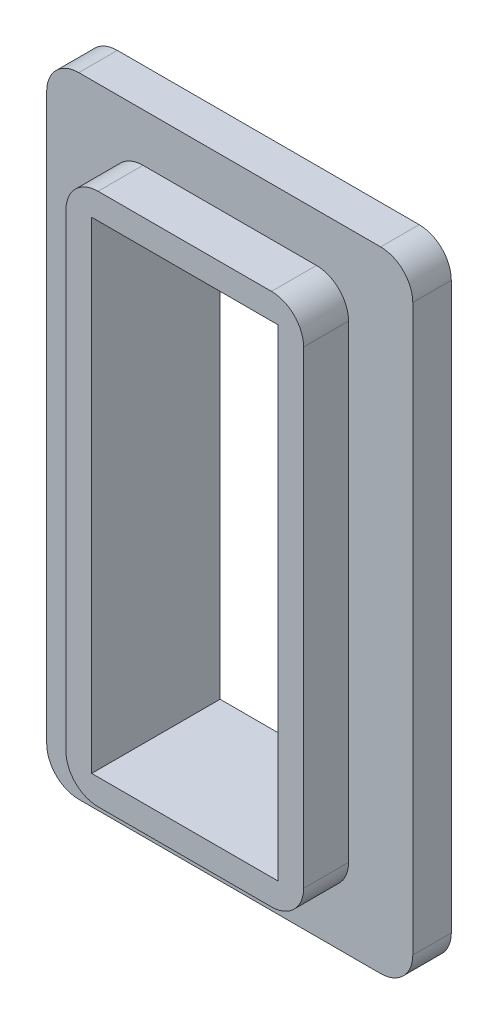
ISO-10303-21;
HEADER;
FILE_DESCRIPTION(('STEP AP214'),'2;1');
FILE_NAME('part.step','',(''),(''),'','','');
FILE_SCHEMA(('AUTOMOTIVE_DESIGN { 1 0 10303 214 1 1 1 1 }'));
ENDSEC;
DATA;
#1=APPLICATION_CONTEXT('core data for automotive mechanical design processes');
#2=APPLICATION_PROTOCOL_DEFINITION('international standard','automotive_design',2000,#1);
#3=PRODUCT_CONTEXT('',#1,'mechanical');
#4=PRODUCT('Part','Part','',(#3));
#5=PRODUCT_RELATED_PRODUCT_CATEGORY('part','',(#4));
#6=PRODUCT_DEFINITION_FORMATION('','',#4);
#7=PRODUCT_DEFINITION_CONTEXT('part definition',#1,'design');
#8=PRODUCT_DEFINITION('design','',#6,#7);
#9=PRODUCT_DEFINITION_SHAPE('','',#8);
#10=(LENGTH_UNIT() NAMED_UNIT(*) SI_UNIT(.MILLI.,.METRE.));
#11=(NAMED_UNIT(*) PLANE_ANGLE_UNIT() SI_UNIT($,.RADIAN.));
#12=(NAMED_UNIT(*) SI_UNIT($,.STERADIAN.) SOLID_ANGLE_UNIT());
#13=UNCERTAINTY_MEASURE_WITH_UNIT(LENGTH_MEASURE(1.E-05),#10,'distance_accuracy_value','');
#14=(GEOMETRIC_REPRESENTATION_CONTEXT(3) GLOBAL_UNCERTAINTY_ASSIGNED_CONTEXT((#13)) GLOBAL_UNIT_ASSIGNED_CONTEXT((#10,
#11,#12)) REPRESENTATION_CONTEXT('',''));
#15=CARTESIAN_POINT('',(0.,0.,0.));
#16=DIRECTION('',(0.,0.,1.));
#17=DIRECTION('',(1.,0.,0.));
#18=AXIS2_PLACEMENT_3D('',#15,#16,#17);
#19=CARTESIAN_POINT('',(0.,0.,-0.6));
#20=DIRECTION('',(0.,0.,1.));
#21=DIRECTION('',(1.,0.,0.));
#22=AXIS2_PLACEMENT_3D('',#19,#20,#21);
#23=PLANE('',#22);
#24=DIRECTION('',(-1.,0.,0.));
#25=VECTOR('',#24,1.);
#26=CARTESIAN_POINT('',(0.,-9.8,-0.6));
#27=LINE('',#26,#25);
#28=CARTESIAN_POINT('',(4.7,-9.8,-0.6));
#29=VERTEX_POINT('',#28);
#30=CARTESIAN_POINT('',(-4.7,-9.8,-0.6));
#31=VERTEX_POINT('',#30);
#32=EDGE_CURVE('E362',#29,#31,#27,.T.);
#33=ORIENTED_EDGE('',*,*,#32,.T.);
#34=CARTESIAN_POINT('',(-4.7,-8.8,-0.6));
#35=DIRECTION('',(0.,0.,1.));
#36=DIRECTION('',(1.,0.,0.));
#37=AXIS2_PLACEMENT_3D('',#34,#35,#36);
#38=CIRCLE('',#37,1.);
#39=CARTESIAN_POINT('',(-5.7,-8.8,-0.6));
#40=VERTEX_POINT('',#39);
#41=EDGE_CURVE('E435',#31,#40,#38,.F.);
#42=ORIENTED_EDGE('',*,*,#41,.T.);
#43=DIRECTION('',(0.,1.,0.));
#44=VECTOR('',#43,1.);
#45=CARTESIAN_POINT('',(-5.7,0.,-0.6));
#46=LINE('',#45,#44);
#47=CARTESIAN_POINT('',(-5.7,8.8,-0.6));
#48=VERTEX_POINT('',#47);
#49=EDGE_CURVE('E359',#40,#48,#46,.T.);
#50=ORIENTED_EDGE('',*,*,#49,.T.);
#51=CARTESIAN_POINT('',(-4.7,8.8,-0.6));
#52=DIRECTION('',(0.,0.,1.));
#53=DIRECTION('',(1.,0.,0.));
#54=AXIS2_PLACEMENT_3D('',#51,#52,#53);
#55=CIRCLE('',#54,1.);
#56=CARTESIAN_POINT('',(-4.7,9.8,-0.6));
#57=VERTEX_POINT('',#56);
#58=EDGE_CURVE('E429',#48,#57,#55,.F.);
#59=ORIENTED_EDGE('',*,*,#58,.T.);
#60=DIRECTION('',(-1.,0.,0.));
#61=VECTOR('',#60,1.);
#62=CARTESIAN_POINT('',(0.,9.8,-0.6));
#63=LINE('',#62,#61);
#64=CARTESIAN_POINT('',(4.7,9.8,-0.6));
#65=VERTEX_POINT('',#64);
#66=EDGE_CURVE('E368',#65,#57,#63,.T.);
#67=ORIENTED_EDGE('',*,*,#66,.F.);
#68=CARTESIAN_POINT('',(4.7,8.8,-0.6));
#69=DIRECTION('',(0.,0.,1.));
#70=DIRECTION('',(1.,0.,0.));
#71=AXIS2_PLACEMENT_3D('',#68,#69,#70);
#72=CIRCLE('',#71,1.);
#73=CARTESIAN_POINT('',(5.7,8.8,-0.6));
#74=VERTEX_POINT('',#73);
#75=EDGE_CURVE('E431',#65,#74,#72,.F.);
#76=ORIENTED_EDGE('',*,*,#75,.T.);
#77=DIRECTION('',(0.,1.,0.));
#78=VECTOR('',#77,1.);
#79=CARTESIAN_POINT('',(5.7,0.,-0.6));
#80=LINE('',#79,#78);
#81=CARTESIAN_POINT('',(5.7,-8.8,-0.6));
#82=VERTEX_POINT('',#81);
#83=EDGE_CURVE('E365',#82,#74,#80,.T.);
#84=ORIENTED_EDGE('',*,*,#83,.F.);
#85=CARTESIAN_POINT('',(4.7,-8.8,-0.6));
#86=DIRECTION('',(0.,0.,1.));
#87=DIRECTION('',(1.,0.,0.));
#88=AXIS2_PLACEMENT_3D('',#85,#86,#87);
#89=CIRCLE('',#88,1.);
#90=EDGE_CURVE('E433',#82,#29,#89,.F.);
#91=ORIENTED_EDGE('',*,*,#90,.T.);
#92=EDGE_LOOP('',(#33,#42,#50,#59,#67,#76,#84,#91));
#93=FACE_BOUND('',#92,.T.);
#94=DIRECTION('',(0.,1.,0.));
#95=VECTOR('',#94,1.);
#96=CARTESIAN_POINT('',(-3.7,0.,-0.6));
#97=LINE('',#96,#95);
#98=CARTESIAN_POINT('',(-3.7,-7.3,-0.6));
#99=VERTEX_POINT('',#98);
#100=CARTESIAN_POINT('',(-3.7,7.3,-0.6));
#101=VERTEX_POINT('',#100);
#102=EDGE_CURVE('E344',#99,#101,#97,.T.);
#103=ORIENTED_EDGE('',*,*,#102,.F.);
#104=CARTESIAN_POINT('',(-2.7,-7.3,-0.6));
#105=DIRECTION('',(0.,0.,1.));
#106=DIRECTION('',(1.,0.,0.));
#107=AXIS2_PLACEMENT_3D('',#104,#105,#106);
#108=CIRCLE('',#107,1.);
#109=CARTESIAN_POINT('',(-2.7,-8.3,-0.6));
#110=VERTEX_POINT('',#109);
#111=EDGE_CURVE('E478',#99,#110,#108,.T.);
#112=ORIENTED_EDGE('',*,*,#111,.T.);
#113=DIRECTION('',(1.,0.,0.));
#114=VECTOR('',#113,1.);
#115=CARTESIAN_POINT('',(0.,-8.3,-0.6));
#116=LINE('',#115,#114);
#117=CARTESIAN_POINT('',(2.7,-8.3,-0.6));
#118=VERTEX_POINT('',#117);
#119=EDGE_CURVE('E335',#110,#118,#116,.T.);
#120=ORIENTED_EDGE('',*,*,#119,.T.);
#121=CARTESIAN_POINT('',(2.7,-7.3,-0.6));
#122=DIRECTION('',(0.,0.,1.));
#123=DIRECTION('',(1.,0.,0.));
#124=AXIS2_PLACEMENT_3D('',#121,#122,#123);
#125=CIRCLE('',#124,1.);
#126=CARTESIAN_POINT('',(3.7,-7.3,-0.6));
#127=VERTEX_POINT('',#126);
#128=EDGE_CURVE('E476',#118,#127,#125,.T.);
#129=ORIENTED_EDGE('',*,*,#128,.T.);
#130=DIRECTION('',(0.,1.,0.));
#131=VECTOR('',#130,1.);
#132=CARTESIAN_POINT('',(3.7,0.,-0.6));
#133=LINE('',#132,#131);
#134=CARTESIAN_POINT('',(3.7,7.3,-0.6));
#135=VERTEX_POINT('',#134);
#136=EDGE_CURVE('E338',#127,#135,#133,.T.);
#137=ORIENTED_EDGE('',*,*,#136,.T.);
#138=CARTESIAN_POINT('',(2.7,7.3,-0.6));
#139=DIRECTION('',(0.,0.,1.));
#140=DIRECTION('',(1.,0.,0.));
#141=AXIS2_PLACEMENT_3D('',#138,#139,#140);
#142=CIRCLE('',#141,1.);
#143=CARTESIAN_POINT('',(2.7,8.3,-0.6));
#144=VERTEX_POINT('',#143);
#145=EDGE_CURVE('E474',#135,#144,#142,.T.);
#146=ORIENTED_EDGE('',*,*,#145,.T.);
#147=DIRECTION('',(1.,0.,0.));
#148=VECTOR('',#147,1.);
#149=CARTESIAN_POINT('',(0.,8.3,-0.6));
#150=LINE('',#149,#148);
#151=CARTESIAN_POINT('',(-2.7,8.3,-0.6));
#152=VERTEX_POINT('',#151);
#153=EDGE_CURVE('E341',#152,#144,#150,.T.);
#154=ORIENTED_EDGE('',*,*,#153,.F.);
#155=CARTESIAN_POINT('',(-2.7,7.3,-0.6));
#156=DIRECTION('',(0.,0.,1.));
#157=DIRECTION('',(1.,0.,0.));
#158=AXIS2_PLACEMENT_3D('',#155,#156,#157);
#159=CIRCLE('',#158,1.);
#160=EDGE_CURVE('E472',#152,#101,#159,.T.);
#161=ORIENTED_EDGE('',*,*,#160,.T.);
#162=EDGE_LOOP('',(#103,#112,#120,#129,#137,#146,#154,#161));
#163=FACE_BOUND('',#162,.T.);
#164=ADVANCED_FACE('F85',(#93,#163),#23,.F.);
#165=CARTESIAN_POINT('',(0.,0.,0.6));
#166=DIRECTION('',(0.,0.,1.));
#167=DIRECTION('',(1.,0.,0.));
#168=AXIS2_PLACEMENT_3D('',#165,#166,#167);
#169=PLANE('',#168);
#170=DIRECTION('',(0.,1.,0.));
#171=VECTOR('',#170,1.);
#172=CARTESIAN_POINT('',(-5.7,0.,0.6));
#173=LINE('',#172,#171);
#174=CARTESIAN_POINT('',(-5.7,-8.8,0.6));
#175=VERTEX_POINT('',#174);
#176=CARTESIAN_POINT('',(-5.7,8.8,0.6));
#177=VERTEX_POINT('',#176);
#178=EDGE_CURVE('E347',#175,#177,#173,.T.);
#179=ORIENTED_EDGE('',*,*,#178,.F.);
#180=CARTESIAN_POINT('',(-4.7,-8.8,0.6));
#181=DIRECTION('',(0.,0.,1.));
#182=DIRECTION('',(1.,0.,0.));
#183=AXIS2_PLACEMENT_3D('',#180,#181,#182);
#184=CIRCLE('',#183,1.);
#185=CARTESIAN_POINT('',(-4.7,-9.8,0.6));
#186=VERTEX_POINT('',#185);
#187=EDGE_CURVE('E422',#175,#186,#184,.T.);
#188=ORIENTED_EDGE('',*,*,#187,.T.);
#189=DIRECTION('',(-1.,0.,0.));
#190=VECTOR('',#189,1.);
#191=CARTESIAN_POINT('',(0.,-9.8,0.6));
#192=LINE('',#191,#190);
#193=CARTESIAN_POINT('',(4.7,-9.8,0.6));
#194=VERTEX_POINT('',#193);
#195=EDGE_CURVE('E350',#194,#186,#192,.T.);
#196=ORIENTED_EDGE('',*,*,#195,.F.);
#197=CARTESIAN_POINT('',(4.7,-8.8,0.6));
#198=DIRECTION('',(0.,0.,1.));
#199=DIRECTION('',(1.,0.,0.));
#200=AXIS2_PLACEMENT_3D('',#197,#198,#199);
#201=CIRCLE('',#200,1.);
#202=CARTESIAN_POINT('',(5.7,-8.8,0.6));
#203=VERTEX_POINT('',#202);
#204=EDGE_CURVE('E420',#194,#203,#201,.T.);
#205=ORIENTED_EDGE('',*,*,#204,.T.);
#206=DIRECTION('',(0.,1.,0.));
#207=VECTOR('',#206,1.);
#208=CARTESIAN_POINT('',(5.7,0.,0.6));
#209=LINE('',#208,#207);
#210=CARTESIAN_POINT('',(5.7,8.8,0.6));
#211=VERTEX_POINT('',#210);
#212=EDGE_CURVE('E353',#203,#211,#209,.T.);
#213=ORIENTED_EDGE('',*,*,#212,.T.);
#214=CARTESIAN_POINT('',(4.7,8.8,0.6));
#215=DIRECTION('',(0.,0.,1.));
#216=DIRECTION('',(1.,0.,0.));
#217=AXIS2_PLACEMENT_3D('',#214,#215,#216);
#218=CIRCLE('',#217,1.);
#219=CARTESIAN_POINT('',(4.7,9.8,0.6));
#220=VERTEX_POINT('',#219);
#221=EDGE_CURVE('E418',#211,#220,#218,.T.);
#222=ORIENTED_EDGE('',*,*,#221,.T.);
#223=DIRECTION('',(-1.,0.,0.));
#224=VECTOR('',#223,1.);
#225=CARTESIAN_POINT('',(0.,9.8,0.6));
#226=LINE('',#225,#224);
#227=CARTESIAN_POINT('',(-4.7,9.8,0.6));
#228=VERTEX_POINT('',#227);
#229=EDGE_CURVE('E356',#220,#228,#226,.T.);
#230=ORIENTED_EDGE('',*,*,#229,.T.);
#231=CARTESIAN_POINT('',(-4.7,8.8,0.6));
#232=DIRECTION('',(0.,0.,1.));
#233=DIRECTION('',(1.,0.,0.));
#234=AXIS2_PLACEMENT_3D('',#231,#232,#233);
#235=CIRCLE('',#234,1.);
#236=EDGE_CURVE('E416',#228,#177,#235,.T.);
#237=ORIENTED_EDGE('',*,*,#236,.T.);
#238=EDGE_LOOP('',(#179,#188,#196,#205,#213,#222,#230,#237));
#239=FACE_BOUND('',#238,.T.);
#240=DIRECTION('',(1.,0.,0.));
#241=VECTOR('',#240,1.);
#242=CARTESIAN_POINT('',(0.,-8.3,0.6));
#243=LINE('',#242,#241);
#244=CARTESIAN_POINT('',(-2.7,-8.3,0.6));
#245=VERTEX_POINT('',#244);
#246=CARTESIAN_POINT('',(2.7,-8.3,0.6));
#247=VERTEX_POINT('',#246);
#248=EDGE_CURVE('E371',#245,#247,#243,.T.);
#249=ORIENTED_EDGE('',*,*,#248,.F.);
#250=CARTESIAN_POINT('',(-2.7,-7.3,0.6));
#251=DIRECTION('',(0.,0.,1.));
#252=DIRECTION('',(1.,0.,0.));
#253=AXIS2_PLACEMENT_3D('',#250,#251,#252);
#254=CIRCLE('',#253,1.);
#255=CARTESIAN_POINT('',(-3.7,-7.3,0.6));
#256=VERTEX_POINT('',#255);
#257=EDGE_CURVE('E482',#245,#256,#254,.F.);
#258=ORIENTED_EDGE('',*,*,#257,.T.);
#259=DIRECTION('',(0.,1.,0.));
#260=VECTOR('',#259,1.);
#261=CARTESIAN_POINT('',(-3.7,0.,0.6));
#262=LINE('',#261,#260);
#263=CARTESIAN_POINT('',(-3.7,7.3,0.6));
#264=VERTEX_POINT('',#263);
#265=EDGE_CURVE('E380',#256,#264,#262,.T.);
#266=ORIENTED_EDGE('',*,*,#265,.T.);
#267=CARTESIAN_POINT('',(-2.7,7.3,0.6));
#268=DIRECTION('',(0.,0.,1.));
#269=DIRECTION('',(1.,0.,0.));
#270=AXIS2_PLACEMENT_3D('',#267,#268,#269);
#271=CIRCLE('',#270,1.);
#272=CARTESIAN_POINT('',(-2.7,8.3,0.6));
#273=VERTEX_POINT('',#272);
#274=EDGE_CURVE('E93',#264,#273,#271,.F.);
#275=ORIENTED_EDGE('',*,*,#274,.T.);
#276=DIRECTION('',(1.,0.,0.));
#277=VECTOR('',#276,1.);
#278=CARTESIAN_POINT('',(0.,8.3,0.6));
#279=LINE('',#278,#277);
#280=CARTESIAN_POINT('',(2.7,8.3,0.6));
#281=VERTEX_POINT('',#280);
#282=EDGE_CURVE('E377',#273,#281,#279,.T.);
#283=ORIENTED_EDGE('',*,*,#282,.T.);
#284=CARTESIAN_POINT('',(2.7,7.3,0.6));
#285=DIRECTION('',(0.,0.,1.));
#286=DIRECTION('',(1.,0.,0.));
#287=AXIS2_PLACEMENT_3D('',#284,#285,#286);
#288=CIRCLE('',#287,1.);
#289=CARTESIAN_POINT('',(3.7,7.3,0.6));
#290=VERTEX_POINT('',#289);
#291=EDGE_CURVE('E12',#281,#290,#288,.F.);
#292=ORIENTED_EDGE('',*,*,#291,.T.);
#293=DIRECTION('',(0.,1.,0.));
#294=VECTOR('',#293,1.);
#295=CARTESIAN_POINT('',(3.7,0.,0.6));
#296=LINE('',#295,#294);
#297=CARTESIAN_POINT('',(3.7,-7.3,0.6));
#298=VERTEX_POINT('',#297);
#299=EDGE_CURVE('E374',#298,#290,#296,.T.);
#300=ORIENTED_EDGE('',*,*,#299,.F.);
#301=CARTESIAN_POINT('',(2.7,-7.3,0.6));
#302=DIRECTION('',(0.,0.,1.));
#303=DIRECTION('',(1.,0.,0.));
#304=AXIS2_PLACEMENT_3D('',#301,#302,#303);
#305=CIRCLE('',#304,1.);
#306=EDGE_CURVE('E480',#298,#247,#305,.F.);
#307=ORIENTED_EDGE('',*,*,#306,.T.);
#308=EDGE_LOOP('',(#249,#258,#266,#275,#283,#292,#300,#307));
#309=FACE_BOUND('',#308,.T.);
#310=ADVANCED_FACE('F487',(#239,#309),#169,.T.);
#311=CARTESIAN_POINT('',(-5.7,0.,-0.6));
#312=DIRECTION('',(1.,0.,0.));
#313=DIRECTION('',(0.,0.,-1.));
#314=AXIS2_PLACEMENT_3D('',#311,#312,#313);
#315=PLANE('',#314);
#316=ORIENTED_EDGE('',*,*,#49,.F.);
#317=DIRECTION('',(0.,0.,1.));
#318=VECTOR('',#317,1.);
#319=CARTESIAN_POINT('',(-5.7,-8.8,-0.6));
#320=LINE('',#319,#318);
#321=EDGE_CURVE('E413',#40,#175,#320,.T.);
#322=ORIENTED_EDGE('',*,*,#321,.T.);
#323=ORIENTED_EDGE('',*,*,#178,.T.);
#324=DIRECTION('',(0.,0.,1.));
#325=VECTOR('',#324,1.);
#326=CARTESIAN_POINT('',(-5.7,8.8,-0.6));
#327=LINE('',#326,#325);
#328=EDGE_CURVE('E411',#177,#48,#327,.F.);
#329=ORIENTED_EDGE('',*,*,#328,.T.);
#330=EDGE_LOOP('',(#316,#322,#323,#329));
#331=FACE_BOUND('',#330,.T.);
#332=ADVANCED_FACE('F514',(#331),#315,.F.);
#333=CARTESIAN_POINT('',(0.,9.8,-0.6));
#334=DIRECTION('',(0.,1.,0.));
#335=DIRECTION('',(0.,0.,1.));
#336=AXIS2_PLACEMENT_3D('',#333,#334,#335);
#337=PLANE('',#336);
#338=ORIENTED_EDGE('',*,*,#229,.F.);
#339=DIRECTION('',(0.,0.,1.));
#340=VECTOR('',#339,1.);
#341=CARTESIAN_POINT('',(4.7,9.8,-0.6));
#342=LINE('',#341,#340);
#343=EDGE_CURVE('E470',#220,#65,#342,.F.);
#344=ORIENTED_EDGE('',*,*,#343,.T.);
#345=ORIENTED_EDGE('',*,*,#66,.T.);
#346=DIRECTION('',(0.,0.,1.));
#347=VECTOR('',#346,1.);
#348=CARTESIAN_POINT('',(-4.7,9.8,0.6));
#349=LINE('',#348,#347);
#350=EDGE_CURVE('E467',#57,#228,#349,.T.);
#351=ORIENTED_EDGE('',*,*,#350,.T.);
#352=EDGE_LOOP('',(#338,#344,#345,#351));
#353=FACE_BOUND('',#352,.T.);
#354=ADVANCED_FACE('F520',(#353),#337,.T.);
#355=CARTESIAN_POINT('',(5.7,0.,-0.6));
#356=DIRECTION('',(1.,0.,0.));
#357=DIRECTION('',(0.,0.,-1.));
#358=AXIS2_PLACEMENT_3D('',#355,#356,#357);
#359=PLANE('',#358);
#360=ORIENTED_EDGE('',*,*,#212,.F.);
#361=DIRECTION('',(0.,0.,1.));
#362=VECTOR('',#361,1.);
#363=CARTESIAN_POINT('',(5.7,-8.8,-0.6));
#364=LINE('',#363,#362);
#365=EDGE_CURVE('E440',#203,#82,#364,.F.);
#366=ORIENTED_EDGE('',*,*,#365,.T.);
#367=ORIENTED_EDGE('',*,*,#83,.T.);
#368=DIRECTION('',(0.,0.,1.));
#369=VECTOR('',#368,1.);
#370=CARTESIAN_POINT('',(5.7,8.8,-0.6));
#371=LINE('',#370,#369);
#372=EDGE_CURVE('E437',#74,#211,#371,.T.);
#373=ORIENTED_EDGE('',*,*,#372,.T.);
#374=EDGE_LOOP('',(#360,#366,#367,#373));
#375=FACE_BOUND('',#374,.T.);
#376=ADVANCED_FACE('F523',(#375),#359,.T.);
#377=CARTESIAN_POINT('',(0.,-9.8,-0.6));
#378=DIRECTION('',(0.,1.,0.));
#379=DIRECTION('',(0.,0.,1.));
#380=AXIS2_PLACEMENT_3D('',#377,#378,#379);
#381=PLANE('',#380);
#382=ORIENTED_EDGE('',*,*,#195,.T.);
#383=DIRECTION('',(0.,0.,1.));
#384=VECTOR('',#383,1.);
#385=CARTESIAN_POINT('',(-4.7,-9.8,-0.6));
#386=LINE('',#385,#384);
#387=EDGE_CURVE('E427',#186,#31,#386,.F.);
#388=ORIENTED_EDGE('',*,*,#387,.T.);
#389=ORIENTED_EDGE('',*,*,#32,.F.);
#390=DIRECTION('',(0.,0.,1.));
#391=VECTOR('',#390,1.);
#392=CARTESIAN_POINT('',(4.7,-9.8,0.6));
#393=LINE('',#392,#391);
#394=EDGE_CURVE('E424',#29,#194,#393,.T.);
#395=ORIENTED_EDGE('',*,*,#394,.T.);
#396=EDGE_LOOP('',(#382,#388,#389,#395));
#397=FACE_BOUND('',#396,.T.);
#398=ADVANCED_FACE('F527',(#397),#381,.F.);
#399=CARTESIAN_POINT('',(-3.7,-8.3,-2.));
#400=DIRECTION('',(0.,-1.,0.));
#401=DIRECTION('',(0.,0.,-1.));
#402=AXIS2_PLACEMENT_3D('',#399,#400,#401);
#403=PLANE('',#402);
#404=ORIENTED_EDGE('',*,*,#248,.T.);
#405=DIRECTION('',(0.,0.,1.));
#406=VECTOR('',#405,1.);
#407=CARTESIAN_POINT('',(2.7,-8.3,-2.));
#408=LINE('',#407,#406);
#409=CARTESIAN_POINT('',(2.7,-8.3,2.));
#410=VERTEX_POINT('',#409);
#411=EDGE_CURVE('E444',#247,#410,#408,.T.);
#412=ORIENTED_EDGE('',*,*,#411,.T.);
#413=DIRECTION('',(1.,0.,0.));
#414=VECTOR('',#413,1.);
#415=CARTESIAN_POINT('',(-3.7,-8.3,2.));
#416=LINE('',#415,#414);
#417=CARTESIAN_POINT('',(-2.7,-8.3,2.));
#418=VERTEX_POINT('',#417);
#419=EDGE_CURVE('E307',#418,#410,#416,.T.);
#420=ORIENTED_EDGE('',*,*,#419,.F.);
#421=DIRECTION('',(0.,0.,1.));
#422=VECTOR('',#421,1.);
#423=CARTESIAN_POINT('',(-2.7,-8.3,0.6));
#424=LINE('',#423,#422);
#425=EDGE_CURVE('E442',#418,#245,#424,.F.);
#426=ORIENTED_EDGE('',*,*,#425,.T.);
#427=EDGE_LOOP('',(#404,#412,#420,#426));
#428=FACE_BOUND('',#427,.T.);
#429=ADVANCED_FACE('F531',(#428),#403,.T.);
#430=CARTESIAN_POINT('',(3.7,-8.3,-2.));
#431=DIRECTION('',(1.,0.,0.));
#432=DIRECTION('',(0.,0.,-1.));
#433=AXIS2_PLACEMENT_3D('',#430,#431,#432);
#434=PLANE('',#433);
#435=DIRECTION('',(0.,1.,0.));
#436=VECTOR('',#435,1.);
#437=CARTESIAN_POINT('',(3.7,-8.3,2.));
#438=LINE('',#437,#436);
#439=CARTESIAN_POINT('',(3.7,-7.3,2.));
#440=VERTEX_POINT('',#439);
#441=CARTESIAN_POINT('',(3.7,7.29999999999999,2.));
#442=VERTEX_POINT('',#441);
#443=EDGE_CURVE('E305',#440,#442,#438,.T.);
#444=ORIENTED_EDGE('',*,*,#443,.F.);
#445=DIRECTION('',(0.,0.,1.));
#446=VECTOR('',#445,1.);
#447=CARTESIAN_POINT('',(3.7,-7.3,-2.));
#448=LINE('',#447,#446);
#449=EDGE_CURVE('E456',#440,#298,#448,.F.);
#450=ORIENTED_EDGE('',*,*,#449,.T.);
#451=ORIENTED_EDGE('',*,*,#299,.T.);
#452=DIRECTION('',(0.,0.,1.));
#453=VECTOR('',#452,1.);
#454=CARTESIAN_POINT('',(3.7,7.3,2.));
#455=LINE('',#454,#453);
#456=EDGE_CURVE('E453',#290,#442,#455,.T.);
#457=ORIENTED_EDGE('',*,*,#456,.T.);
#458=EDGE_LOOP('',(#444,#450,#451,#457));
#459=FACE_BOUND('',#458,.T.);
#460=ADVANCED_FACE('F580',(#459),#434,.T.);
#461=CARTESIAN_POINT('',(-3.7,8.3,-2.));
#462=DIRECTION('',(0.,-1.,0.));
#463=DIRECTION('',(0.,0.,-1.));
#464=AXIS2_PLACEMENT_3D('',#461,#462,#463);
#465=PLANE('',#464);
#466=ORIENTED_EDGE('',*,*,#282,.F.);
#467=DIRECTION('',(0.,0.,1.));
#468=VECTOR('',#467,1.);
#469=CARTESIAN_POINT('',(-2.7,8.3,-2.));
#470=LINE('',#469,#468);
#471=CARTESIAN_POINT('',(-2.7,8.3,2.));
#472=VERTEX_POINT('',#471);
#473=EDGE_CURVE('E465',#273,#472,#470,.T.);
#474=ORIENTED_EDGE('',*,*,#473,.T.);
#475=DIRECTION('',(1.,0.,0.));
#476=VECTOR('',#475,1.);
#477=CARTESIAN_POINT('',(-3.7,8.3,2.));
#478=LINE('',#477,#476);
#479=CARTESIAN_POINT('',(2.7,8.3,2.));
#480=VERTEX_POINT('',#479);
#481=EDGE_CURVE('E303',#472,#480,#478,.T.);
#482=ORIENTED_EDGE('',*,*,#481,.T.);
#483=DIRECTION('',(0.,0.,1.));
#484=VECTOR('',#483,1.);
#485=CARTESIAN_POINT('',(2.7,8.3,0.6));
#486=LINE('',#485,#484);
#487=EDGE_CURVE('E463',#480,#281,#486,.F.);
#488=ORIENTED_EDGE('',*,*,#487,.T.);
#489=EDGE_LOOP('',(#466,#474,#482,#488));
#490=FACE_BOUND('',#489,.T.);
#491=ADVANCED_FACE('F491',(#490),#465,.F.);
#492=CARTESIAN_POINT('',(-3.7,-8.3,-2.));
#493=DIRECTION('',(1.,0.,0.));
#494=DIRECTION('',(0.,0.,-1.));
#495=AXIS2_PLACEMENT_3D('',#492,#493,#494);
#496=PLANE('',#495);
#497=ORIENTED_EDGE('',*,*,#265,.F.);
#498=DIRECTION('',(0.,0.,1.));
#499=VECTOR('',#498,1.);
#500=CARTESIAN_POINT('',(-3.7,-7.3,2.));
#501=LINE('',#500,#499);
#502=CARTESIAN_POINT('',(-3.7,-7.3,2.));
#503=VERTEX_POINT('',#502);
#504=EDGE_CURVE('E460',#256,#503,#501,.T.);
#505=ORIENTED_EDGE('',*,*,#504,.T.);
#506=DIRECTION('',(0.,1.,0.));
#507=VECTOR('',#506,1.);
#508=CARTESIAN_POINT('',(-3.7,-8.3,2.));
#509=LINE('',#508,#507);
#510=CARTESIAN_POINT('',(-3.7,7.29999999999999,2.));
#511=VERTEX_POINT('',#510);
#512=EDGE_CURVE('E300',#503,#511,#509,.T.);
#513=ORIENTED_EDGE('',*,*,#512,.T.);
#514=DIRECTION('',(0.,0.,1.));
#515=VECTOR('',#514,1.);
#516=CARTESIAN_POINT('',(-3.7,7.3,-2.));
#517=LINE('',#516,#515);
#518=EDGE_CURVE('E458',#511,#264,#517,.F.);
#519=ORIENTED_EDGE('',*,*,#518,.T.);
#520=EDGE_LOOP('',(#497,#505,#513,#519));
#521=FACE_BOUND('',#520,.T.);
#522=ADVANCED_FACE('F575',(#521),#496,.F.);
#523=CARTESIAN_POINT('',(0.,0.,2.));
#524=DIRECTION('',(0.,0.,-1.));
#525=DIRECTION('',(-1.,0.,0.));
#526=AXIS2_PLACEMENT_3D('',#523,#524,#525);
#527=PLANE('',#526);
#528=DIRECTION('',(1.,0.,0.));
#529=VECTOR('',#528,1.);
#530=CARTESIAN_POINT('',(-2.9,-7.5,2.));
#531=LINE('',#530,#529);
#532=CARTESIAN_POINT('',(-2.9,-7.5,2.));
#533=VERTEX_POINT('',#532);
#534=CARTESIAN_POINT('',(2.9,-7.5,2.));
#535=VERTEX_POINT('',#534);
#536=EDGE_CURVE('E295',#533,#535,#531,.T.);
#537=ORIENTED_EDGE('',*,*,#536,.F.);
#538=DIRECTION('',(0.,1.,0.));
#539=VECTOR('',#538,1.);
#540=CARTESIAN_POINT('',(-2.9,-7.5,2.));
#541=LINE('',#540,#539);
#542=CARTESIAN_POINT('',(-2.9,7.5,2.));
#543=VERTEX_POINT('',#542);
#544=EDGE_CURVE('E275',#533,#543,#541,.T.);
#545=ORIENTED_EDGE('',*,*,#544,.T.);
#546=DIRECTION('',(1.,0.,0.));
#547=VECTOR('',#546,1.);
#548=CARTESIAN_POINT('',(-2.9,7.5,2.));
#549=LINE('',#548,#547);
#550=CARTESIAN_POINT('',(2.9,7.5,2.));
#551=VERTEX_POINT('',#550);
#552=EDGE_CURVE('E285',#543,#551,#549,.T.);
#553=ORIENTED_EDGE('',*,*,#552,.T.);
#554=DIRECTION('',(0.,1.,0.));
#555=VECTOR('',#554,1.);
#556=CARTESIAN_POINT('',(2.9,-7.5,2.));
#557=LINE('',#556,#555);
#558=EDGE_CURVE('E291',#535,#551,#557,.T.);
#559=ORIENTED_EDGE('',*,*,#558,.F.);
#560=EDGE_LOOP('',(#537,#545,#553,#559));
#561=FACE_BOUND('',#560,.T.);
#562=ORIENTED_EDGE('',*,*,#419,.T.);
#563=CARTESIAN_POINT('',(2.7,-7.3,2.));
#564=DIRECTION('',(0.,0.,-1.));
#565=DIRECTION('',(-1.,0.,0.));
#566=AXIS2_PLACEMENT_3D('',#563,#564,#565);
#567=CIRCLE('',#566,1.);
#568=EDGE_CURVE('E451',#410,#440,#567,.F.);
#569=ORIENTED_EDGE('',*,*,#568,.T.);
#570=ORIENTED_EDGE('',*,*,#443,.T.);
#571=CARTESIAN_POINT('',(2.7,7.3,2.));
#572=DIRECTION('',(0.,0.,-1.));
#573=DIRECTION('',(-1.,0.,0.));
#574=AXIS2_PLACEMENT_3D('',#571,#572,#573);
#575=CIRCLE('',#574,1.);
#576=EDGE_CURVE('E100',#442,#480,#575,.F.);
#577=ORIENTED_EDGE('',*,*,#576,.T.);
#578=ORIENTED_EDGE('',*,*,#481,.F.);
#579=CARTESIAN_POINT('',(-2.7,7.3,2.));
#580=DIRECTION('',(0.,0.,-1.));
#581=DIRECTION('',(-1.,0.,0.));
#582=AXIS2_PLACEMENT_3D('',#579,#580,#581);
#583=CIRCLE('',#582,1.);
#584=EDGE_CURVE('E108',#472,#511,#583,.F.);
#585=ORIENTED_EDGE('',*,*,#584,.T.);
#586=ORIENTED_EDGE('',*,*,#512,.F.);
#587=CARTESIAN_POINT('',(-2.7,-7.3,2.));
#588=DIRECTION('',(0.,0.,-1.));
#589=DIRECTION('',(-1.,0.,0.));
#590=AXIS2_PLACEMENT_3D('',#587,#588,#589);
#591=CIRCLE('',#590,1.);
#592=EDGE_CURVE('E449',#503,#418,#591,.F.);
#593=ORIENTED_EDGE('',*,*,#592,.T.);
#594=EDGE_LOOP('',(#562,#569,#570,#577,#578,#585,#586,#593));
#595=FACE_BOUND('',#594,.T.);
#596=ADVANCED_FACE('F293',(#561,#595),#527,.F.);
#597=ORIENTED_EDGE('',*,*,#102,.T.);
#598=DIRECTION('',(0.,0.,1.));
#599=VECTOR('',#598,1.);
#600=CARTESIAN_POINT('',(-3.7,7.3,-2.));
#601=LINE('',#600,#599);
#602=CARTESIAN_POINT('',(-3.7,7.29999999999999,-2.));
#603=VERTEX_POINT('',#602);
#604=EDGE_CURVE('E391',#101,#603,#601,.F.);
#605=ORIENTED_EDGE('',*,*,#604,.T.);
#606=DIRECTION('',(0.,1.,0.));
#607=VECTOR('',#606,1.);
#608=CARTESIAN_POINT('',(-3.7,-8.3,-2.));
#609=LINE('',#608,#607);
#610=CARTESIAN_POINT('',(-3.7,-7.3,-2.));
#611=VERTEX_POINT('',#610);
#612=EDGE_CURVE('E281',#611,#603,#609,.T.);
#613=ORIENTED_EDGE('',*,*,#612,.F.);
#614=DIRECTION('',(0.,0.,1.));
#615=VECTOR('',#614,1.);
#616=CARTESIAN_POINT('',(-3.7,-7.3,-0.6));
#617=LINE('',#616,#615);
#618=EDGE_CURVE('E388',#611,#99,#617,.T.);
#619=ORIENTED_EDGE('',*,*,#618,.T.);
#620=EDGE_LOOP('',(#597,#605,#613,#619));
#621=FACE_BOUND('',#620,.T.);
#622=ADVANCED_FACE('F599',(#621),#496,.F.);
#623=DIRECTION('',(1.,0.,0.));
#624=VECTOR('',#623,1.);
#625=CARTESIAN_POINT('',(-3.7,8.3,-2.));
#626=LINE('',#625,#624);
#627=CARTESIAN_POINT('',(-2.7,8.3,-2.));
#628=VERTEX_POINT('',#627);
#629=CARTESIAN_POINT('',(2.7,8.3,-2.));
#630=VERTEX_POINT('',#629);
#631=EDGE_CURVE('E326',#628,#630,#626,.T.);
#632=ORIENTED_EDGE('',*,*,#631,.F.);
#633=DIRECTION('',(0.,0.,1.));
#634=VECTOR('',#633,1.);
#635=CARTESIAN_POINT('',(-2.7,8.3,-2.));
#636=LINE('',#635,#634);
#637=EDGE_CURVE('E385',#628,#152,#636,.T.);
#638=ORIENTED_EDGE('',*,*,#637,.T.);
#639=ORIENTED_EDGE('',*,*,#153,.T.);
#640=DIRECTION('',(0.,0.,1.));
#641=VECTOR('',#640,1.);
#642=CARTESIAN_POINT('',(2.7,8.3,-2.));
#643=LINE('',#642,#641);
#644=EDGE_CURVE('E383',#144,#630,#643,.F.);
#645=ORIENTED_EDGE('',*,*,#644,.T.);
#646=EDGE_LOOP('',(#632,#638,#639,#645));
#647=FACE_BOUND('',#646,.T.);
#648=ADVANCED_FACE('F589',(#647),#465,.F.);
#649=DIRECTION('',(0.,1.,0.));
#650=VECTOR('',#649,1.);
#651=CARTESIAN_POINT('',(3.7,-8.3,-2.));
#652=LINE('',#651,#650);
#653=CARTESIAN_POINT('',(3.7,-7.3,-2.));
#654=VERTEX_POINT('',#653);
#655=CARTESIAN_POINT('',(3.7,7.29999999999999,-2.));
#656=VERTEX_POINT('',#655);
#657=EDGE_CURVE('E329',#654,#656,#652,.T.);
#658=ORIENTED_EDGE('',*,*,#657,.T.);
#659=DIRECTION('',(0.,0.,1.));
#660=VECTOR('',#659,1.);
#661=CARTESIAN_POINT('',(3.7,7.3,-0.6));
#662=LINE('',#661,#660);
#663=EDGE_CURVE('E403',#656,#135,#662,.T.);
#664=ORIENTED_EDGE('',*,*,#663,.T.);
#665=ORIENTED_EDGE('',*,*,#136,.F.);
#666=DIRECTION('',(0.,0.,1.));
#667=VECTOR('',#666,1.);
#668=CARTESIAN_POINT('',(3.7,-7.3,-2.));
#669=LINE('',#668,#667);
#670=EDGE_CURVE('E401',#127,#654,#669,.F.);
#671=ORIENTED_EDGE('',*,*,#670,.T.);
#672=EDGE_LOOP('',(#658,#664,#665,#671));
#673=FACE_BOUND('',#672,.T.);
#674=ADVANCED_FACE('F583',(#673),#434,.T.);
#675=DIRECTION('',(1.,0.,0.));
#676=VECTOR('',#675,1.);
#677=CARTESIAN_POINT('',(-3.7,-8.3,-2.));
#678=LINE('',#677,#676);
#679=CARTESIAN_POINT('',(-2.7,-8.3,-2.));
#680=VERTEX_POINT('',#679);
#681=CARTESIAN_POINT('',(2.7,-8.3,-2.));
#682=VERTEX_POINT('',#681);
#683=EDGE_CURVE('E332',#680,#682,#678,.T.);
#684=ORIENTED_EDGE('',*,*,#683,.T.);
#685=DIRECTION('',(0.,0.,1.));
#686=VECTOR('',#685,1.);
#687=CARTESIAN_POINT('',(2.7,-8.3,-2.));
#688=LINE('',#687,#686);
#689=EDGE_CURVE('E408',#682,#118,#688,.T.);
#690=ORIENTED_EDGE('',*,*,#689,.T.);
#691=ORIENTED_EDGE('',*,*,#119,.F.);
#692=DIRECTION('',(0.,0.,1.));
#693=VECTOR('',#692,1.);
#694=CARTESIAN_POINT('',(-2.7,-8.3,-2.));
#695=LINE('',#694,#693);
#696=EDGE_CURVE('E406',#110,#680,#695,.F.);
#697=ORIENTED_EDGE('',*,*,#696,.T.);
#698=EDGE_LOOP('',(#684,#690,#691,#697));
#699=FACE_BOUND('',#698,.T.);
#700=ADVANCED_FACE('F591',(#699),#403,.T.);
#701=CARTESIAN_POINT('',(-2.9,-7.5,-2.));
#702=DIRECTION('',(1.,0.,0.));
#703=DIRECTION('',(0.,0.,-1.));
#704=AXIS2_PLACEMENT_3D('',#701,#702,#703);
#705=PLANE('',#704);
#706=DIRECTION('',(0.,0.,1.));
#707=VECTOR('',#706,1.);
#708=CARTESIAN_POINT('',(-2.9,7.5,-2.));
#709=LINE('',#708,#707);
#710=CARTESIAN_POINT('',(-2.9,7.5,-2.));
#711=VERTEX_POINT('',#710);
#712=EDGE_CURVE('E271',#711,#543,#709,.T.);
#713=ORIENTED_EDGE('',*,*,#712,.T.);
#714=ORIENTED_EDGE('',*,*,#544,.F.);
#715=DIRECTION('',(0.,0.,1.));
#716=VECTOR('',#715,1.);
#717=CARTESIAN_POINT('',(-2.9,-7.5,-2.));
#718=LINE('',#717,#716);
#719=CARTESIAN_POINT('',(-2.9,-7.5,-2.));
#720=VERTEX_POINT('',#719);
#721=EDGE_CURVE('E319',#720,#533,#718,.T.);
#722=ORIENTED_EDGE('',*,*,#721,.F.);
#723=DIRECTION('',(0.,1.,0.));
#724=VECTOR('',#723,1.);
#725=CARTESIAN_POINT('',(-2.9,-7.5,-2.));
#726=LINE('',#725,#724);
#727=EDGE_CURVE('E278',#720,#711,#726,.T.);
#728=ORIENTED_EDGE('',*,*,#727,.T.);
#729=EDGE_LOOP('',(#713,#714,#722,#728));
#730=FACE_BOUND('',#729,.T.);
#731=ADVANCED_FACE('F273',(#730),#705,.T.);
#732=CARTESIAN_POINT('',(-2.9,7.5,-2.));
#733=DIRECTION('',(0.,-1.,0.));
#734=DIRECTION('',(0.,0.,-1.));
#735=AXIS2_PLACEMENT_3D('',#732,#733,#734);
#736=PLANE('',#735);
#737=DIRECTION('',(0.,0.,1.));
#738=VECTOR('',#737,1.);
#739=CARTESIAN_POINT('',(2.9,7.5,-2.));
#740=LINE('',#739,#738);
#741=CARTESIAN_POINT('',(2.9,7.5,-2.));
#742=VERTEX_POINT('',#741);
#743=EDGE_CURVE('E282',#742,#551,#740,.T.);
#744=ORIENTED_EDGE('',*,*,#743,.T.);
#745=ORIENTED_EDGE('',*,*,#552,.F.);
#746=ORIENTED_EDGE('',*,*,#712,.F.);
#747=DIRECTION('',(1.,0.,0.));
#748=VECTOR('',#747,1.);
#749=CARTESIAN_POINT('',(-2.9,7.5,-2.));
#750=LINE('',#749,#748);
#751=EDGE_CURVE('E311',#711,#742,#750,.T.);
#752=ORIENTED_EDGE('',*,*,#751,.T.);
#753=EDGE_LOOP('',(#744,#745,#746,#752));
#754=FACE_BOUND('',#753,.T.);
#755=ADVANCED_FACE('F286',(#754),#736,.T.);
#756=CARTESIAN_POINT('',(2.9,-7.5,-2.));
#757=DIRECTION('',(1.,0.,0.));
#758=DIRECTION('',(0.,0.,-1.));
#759=AXIS2_PLACEMENT_3D('',#756,#757,#758);
#760=PLANE('',#759);
#761=DIRECTION('',(0.,0.,1.));
#762=VECTOR('',#761,1.);
#763=CARTESIAN_POINT('',(2.9,-7.5,-2.));
#764=LINE('',#763,#762);
#765=CARTESIAN_POINT('',(2.9,-7.5,-2.));
#766=VERTEX_POINT('',#765);
#767=EDGE_CURVE('E321',#766,#535,#764,.T.);
#768=ORIENTED_EDGE('',*,*,#767,.T.);
#769=ORIENTED_EDGE('',*,*,#558,.T.);
#770=ORIENTED_EDGE('',*,*,#743,.F.);
#771=DIRECTION('',(0.,1.,0.));
#772=VECTOR('',#771,1.);
#773=CARTESIAN_POINT('',(2.9,-7.5,-2.));
#774=LINE('',#773,#772);
#775=EDGE_CURVE('E313',#766,#742,#774,.T.);
#776=ORIENTED_EDGE('',*,*,#775,.F.);
#777=EDGE_LOOP('',(#768,#769,#770,#776));
#778=FACE_BOUND('',#777,.T.);
#779=ADVANCED_FACE('F628',(#778),#760,.F.);
#780=CARTESIAN_POINT('',(-2.9,-7.5,-2.));
#781=DIRECTION('',(0.,-1.,0.));
#782=DIRECTION('',(0.,0.,-1.));
#783=AXIS2_PLACEMENT_3D('',#780,#781,#782);
#784=PLANE('',#783);
#785=ORIENTED_EDGE('',*,*,#721,.T.);
#786=ORIENTED_EDGE('',*,*,#536,.T.);
#787=ORIENTED_EDGE('',*,*,#767,.F.);
#788=DIRECTION('',(1.,0.,0.));
#789=VECTOR('',#788,1.);
#790=CARTESIAN_POINT('',(-2.9,-7.5,-2.));
#791=LINE('',#790,#789);
#792=EDGE_CURVE('E316',#720,#766,#791,.T.);
#793=ORIENTED_EDGE('',*,*,#792,.F.);
#794=EDGE_LOOP('',(#785,#786,#787,#793));
#795=FACE_BOUND('',#794,.T.);
#796=ADVANCED_FACE('F625',(#795),#784,.F.);
#797=CARTESIAN_POINT('',(0.,0.,-2.));
#798=DIRECTION('',(0.,0.,-1.));
#799=DIRECTION('',(-1.,0.,0.));
#800=AXIS2_PLACEMENT_3D('',#797,#798,#799);
#801=PLANE('',#800);
#802=ORIENTED_EDGE('',*,*,#612,.T.);
#803=CARTESIAN_POINT('',(-2.7,7.3,-2.));
#804=DIRECTION('',(0.,0.,-1.));
#805=DIRECTION('',(-1.,0.,0.));
#806=AXIS2_PLACEMENT_3D('',#803,#804,#805);
#807=CIRCLE('',#806,1.);
#808=EDGE_CURVE('E399',#603,#628,#807,.T.);
#809=ORIENTED_EDGE('',*,*,#808,.T.);
#810=ORIENTED_EDGE('',*,*,#631,.T.);
#811=CARTESIAN_POINT('',(2.7,7.3,-2.));
#812=DIRECTION('',(0.,0.,-1.));
#813=DIRECTION('',(-1.,0.,0.));
#814=AXIS2_PLACEMENT_3D('',#811,#812,#813);
#815=CIRCLE('',#814,1.);
#816=EDGE_CURVE('E397',#630,#656,#815,.T.);
#817=ORIENTED_EDGE('',*,*,#816,.T.);
#818=ORIENTED_EDGE('',*,*,#657,.F.);
#819=CARTESIAN_POINT('',(2.7,-7.3,-2.));
#820=DIRECTION('',(0.,0.,-1.));
#821=DIRECTION('',(-1.,0.,0.));
#822=AXIS2_PLACEMENT_3D('',#819,#820,#821);
#823=CIRCLE('',#822,1.);
#824=EDGE_CURVE('E395',#654,#682,#823,.T.);
#825=ORIENTED_EDGE('',*,*,#824,.T.);
#826=ORIENTED_EDGE('',*,*,#683,.F.);
#827=CARTESIAN_POINT('',(-2.7,-7.3,-2.));
#828=DIRECTION('',(0.,0.,-1.));
#829=DIRECTION('',(-1.,0.,0.));
#830=AXIS2_PLACEMENT_3D('',#827,#828,#829);
#831=CIRCLE('',#830,1.);
#832=EDGE_CURVE('E393',#680,#611,#831,.T.);
#833=ORIENTED_EDGE('',*,*,#832,.T.);
#834=EDGE_LOOP('',(#802,#809,#810,#817,#818,#825,#826,#833));
#835=FACE_BOUND('',#834,.T.);
#836=ORIENTED_EDGE('',*,*,#751,.F.);
#837=ORIENTED_EDGE('',*,*,#727,.F.);
#838=ORIENTED_EDGE('',*,*,#792,.T.);
#839=ORIENTED_EDGE('',*,*,#775,.T.);
#840=EDGE_LOOP('',(#836,#837,#838,#839));
#841=FACE_BOUND('',#840,.T.);
#842=ADVANCED_FACE('F540',(#835,#841),#801,.T.);
#843=CARTESIAN_POINT('',(-2.7,7.3,-2.));
#844=DIRECTION('',(0.,0.,1.));
#845=DIRECTION('',(1.,0.,0.));
#846=AXIS2_PLACEMENT_3D('',#843,#844,#845);
#847=CYLINDRICAL_SURFACE('',#846,1.);
#848=ORIENTED_EDGE('',*,*,#808,.F.);
#849=ORIENTED_EDGE('',*,*,#604,.F.);
#850=ORIENTED_EDGE('',*,*,#160,.F.);
#851=ORIENTED_EDGE('',*,*,#637,.F.);
#852=EDGE_LOOP('',(#848,#849,#850,#851));
#853=FACE_BOUND('',#852,.T.);
#854=ADVANCED_FACE('F536',(#853),#847,.T.);
#855=CARTESIAN_POINT('',(2.7,7.3,-2.));
#856=DIRECTION('',(0.,0.,-1.));
#857=DIRECTION('',(-1.,0.,0.));
#858=AXIS2_PLACEMENT_3D('',#855,#856,#857);
#859=CYLINDRICAL_SURFACE('',#858,1.);
#860=ORIENTED_EDGE('',*,*,#816,.F.);
#861=ORIENTED_EDGE('',*,*,#644,.F.);
#862=ORIENTED_EDGE('',*,*,#145,.F.);
#863=ORIENTED_EDGE('',*,*,#663,.F.);
#864=EDGE_LOOP('',(#860,#861,#862,#863));
#865=FACE_BOUND('',#864,.T.);
#866=ADVANCED_FACE('F539',(#865),#859,.T.);
#867=CARTESIAN_POINT('',(2.7,-7.3,-2.));
#868=DIRECTION('',(0.,0.,1.));
#869=DIRECTION('',(1.,0.,0.));
#870=AXIS2_PLACEMENT_3D('',#867,#868,#869);
#871=CYLINDRICAL_SURFACE('',#870,1.);
#872=ORIENTED_EDGE('',*,*,#824,.F.);
#873=ORIENTED_EDGE('',*,*,#670,.F.);
#874=ORIENTED_EDGE('',*,*,#128,.F.);
#875=ORIENTED_EDGE('',*,*,#689,.F.);
#876=EDGE_LOOP('',(#872,#873,#874,#875));
#877=FACE_BOUND('',#876,.T.);
#878=ADVANCED_FACE('F544',(#877),#871,.T.);
#879=CARTESIAN_POINT('',(-2.7,-7.3,-2.));
#880=DIRECTION('',(0.,0.,-1.));
#881=DIRECTION('',(-1.,0.,0.));
#882=AXIS2_PLACEMENT_3D('',#879,#880,#881);
#883=CYLINDRICAL_SURFACE('',#882,1.);
#884=ORIENTED_EDGE('',*,*,#832,.F.);
#885=ORIENTED_EDGE('',*,*,#696,.F.);
#886=ORIENTED_EDGE('',*,*,#111,.F.);
#887=ORIENTED_EDGE('',*,*,#618,.F.);
#888=EDGE_LOOP('',(#884,#885,#886,#887));
#889=FACE_BOUND('',#888,.T.);
#890=ADVANCED_FACE('F548',(#889),#883,.T.);
#891=CARTESIAN_POINT('',(-4.7,-8.8,-0.6));
#892=DIRECTION('',(0.,0.,1.));
#893=DIRECTION('',(1.,0.,0.));
#894=AXIS2_PLACEMENT_3D('',#891,#892,#893);
#895=CYLINDRICAL_SURFACE('',#894,1.);
#896=ORIENTED_EDGE('',*,*,#41,.F.);
#897=ORIENTED_EDGE('',*,*,#387,.F.);
#898=ORIENTED_EDGE('',*,*,#187,.F.);
#899=ORIENTED_EDGE('',*,*,#321,.F.);
#900=EDGE_LOOP('',(#896,#897,#898,#899));
#901=FACE_BOUND('',#900,.T.);
#902=ADVANCED_FACE('F552',(#901),#895,.T.);
#903=CARTESIAN_POINT('',(4.7,-8.8,-0.6));
#904=DIRECTION('',(0.,0.,-1.));
#905=DIRECTION('',(-1.,0.,0.));
#906=AXIS2_PLACEMENT_3D('',#903,#904,#905);
#907=CYLINDRICAL_SURFACE('',#906,1.);
#908=ORIENTED_EDGE('',*,*,#90,.F.);
#909=ORIENTED_EDGE('',*,*,#365,.F.);
#910=ORIENTED_EDGE('',*,*,#204,.F.);
#911=ORIENTED_EDGE('',*,*,#394,.F.);
#912=EDGE_LOOP('',(#908,#909,#910,#911));
#913=FACE_BOUND('',#912,.T.);
#914=ADVANCED_FACE('F556',(#913),#907,.T.);
#915=CARTESIAN_POINT('',(2.7,-7.3,-2.));
#916=DIRECTION('',(0.,0.,1.));
#917=DIRECTION('',(1.,0.,0.));
#918=AXIS2_PLACEMENT_3D('',#915,#916,#917);
#919=CYLINDRICAL_SURFACE('',#918,1.);
#920=ORIENTED_EDGE('',*,*,#306,.F.);
#921=ORIENTED_EDGE('',*,*,#449,.F.);
#922=ORIENTED_EDGE('',*,*,#568,.F.);
#923=ORIENTED_EDGE('',*,*,#411,.F.);
#924=EDGE_LOOP('',(#920,#921,#922,#923));
#925=FACE_BOUND('',#924,.T.);
#926=ADVANCED_FACE('F505',(#925),#919,.T.);
#927=CARTESIAN_POINT('',(-2.7,-7.3,-2.));
#928=DIRECTION('',(0.,0.,-1.));
#929=DIRECTION('',(-1.,0.,0.));
#930=AXIS2_PLACEMENT_3D('',#927,#928,#929);
#931=CYLINDRICAL_SURFACE('',#930,1.);
#932=ORIENTED_EDGE('',*,*,#257,.F.);
#933=ORIENTED_EDGE('',*,*,#425,.F.);
#934=ORIENTED_EDGE('',*,*,#592,.F.);
#935=ORIENTED_EDGE('',*,*,#504,.F.);
#936=EDGE_LOOP('',(#932,#933,#934,#935));
#937=FACE_BOUND('',#936,.T.);
#938=ADVANCED_FACE('F496',(#937),#931,.T.);
#939=CARTESIAN_POINT('',(-2.7,7.3,-2.));
#940=DIRECTION('',(0.,0.,1.));
#941=DIRECTION('',(1.,0.,0.));
#942=AXIS2_PLACEMENT_3D('',#939,#940,#941);
#943=CYLINDRICAL_SURFACE('',#942,1.);
#944=ORIENTED_EDGE('',*,*,#274,.F.);
#945=ORIENTED_EDGE('',*,*,#518,.F.);
#946=ORIENTED_EDGE('',*,*,#584,.F.);
#947=ORIENTED_EDGE('',*,*,#473,.F.);
#948=EDGE_LOOP('',(#944,#945,#946,#947));
#949=FACE_BOUND('',#948,.T.);
#950=ADVANCED_FACE('F493',(#949),#943,.T.);
#951=CARTESIAN_POINT('',(2.7,7.3,-2.));
#952=DIRECTION('',(0.,0.,-1.));
#953=DIRECTION('',(-1.,0.,0.));
#954=AXIS2_PLACEMENT_3D('',#951,#952,#953);
#955=CYLINDRICAL_SURFACE('',#954,1.);
#956=ORIENTED_EDGE('',*,*,#291,.F.);
#957=ORIENTED_EDGE('',*,*,#487,.F.);
#958=ORIENTED_EDGE('',*,*,#576,.F.);
#959=ORIENTED_EDGE('',*,*,#456,.F.);
#960=EDGE_LOOP('',(#956,#957,#958,#959));
#961=FACE_BOUND('',#960,.T.);
#962=ADVANCED_FACE('F495',(#961),#955,.T.);
#963=CARTESIAN_POINT('',(4.7,8.8,-0.6));
#964=DIRECTION('',(0.,0.,1.));
#965=DIRECTION('',(1.,0.,0.));
#966=AXIS2_PLACEMENT_3D('',#963,#964,#965);
#967=CYLINDRICAL_SURFACE('',#966,1.);
#968=ORIENTED_EDGE('',*,*,#75,.F.);
#969=ORIENTED_EDGE('',*,*,#343,.F.);
#970=ORIENTED_EDGE('',*,*,#221,.F.);
#971=ORIENTED_EDGE('',*,*,#372,.F.);
#972=EDGE_LOOP('',(#968,#969,#970,#971));
#973=FACE_BOUND('',#972,.T.);
#974=ADVANCED_FACE('F502',(#973),#967,.T.);
#975=CARTESIAN_POINT('',(-4.7,8.8,-0.6));
#976=DIRECTION('',(0.,0.,-1.));
#977=DIRECTION('',(-1.,0.,0.));
#978=AXIS2_PLACEMENT_3D('',#975,#976,#977);
#979=CYLINDRICAL_SURFACE('',#978,1.);
#980=ORIENTED_EDGE('',*,*,#58,.F.);
#981=ORIENTED_EDGE('',*,*,#328,.F.);
#982=ORIENTED_EDGE('',*,*,#236,.F.);
#983=ORIENTED_EDGE('',*,*,#350,.F.);
#984=EDGE_LOOP('',(#980,#981,#982,#983));
#985=FACE_BOUND('',#984,.T.);
#986=ADVANCED_FACE('F87',(#985),#979,.T.);
#987=CLOSED_SHELL('',(#164,#310,#332,#354,#376,#398,#429,#460,#491,#522,#596,#622,#648,#674,
#700,#731,#755,#779,#796,#842,#854,#866,#878,#890,#902,#914,#926,#938,#950,#962,#974,#986));
#988=MANIFOLD_SOLID_BREP('B2',#987);
#989=ADVANCED_BREP_SHAPE_REPRESENTATION('',(#18,#988),#14);
#990=SHAPE_DEFINITION_REPRESENTATION(#9,#989);
ENDSEC;
END-ISO-10303-21;
